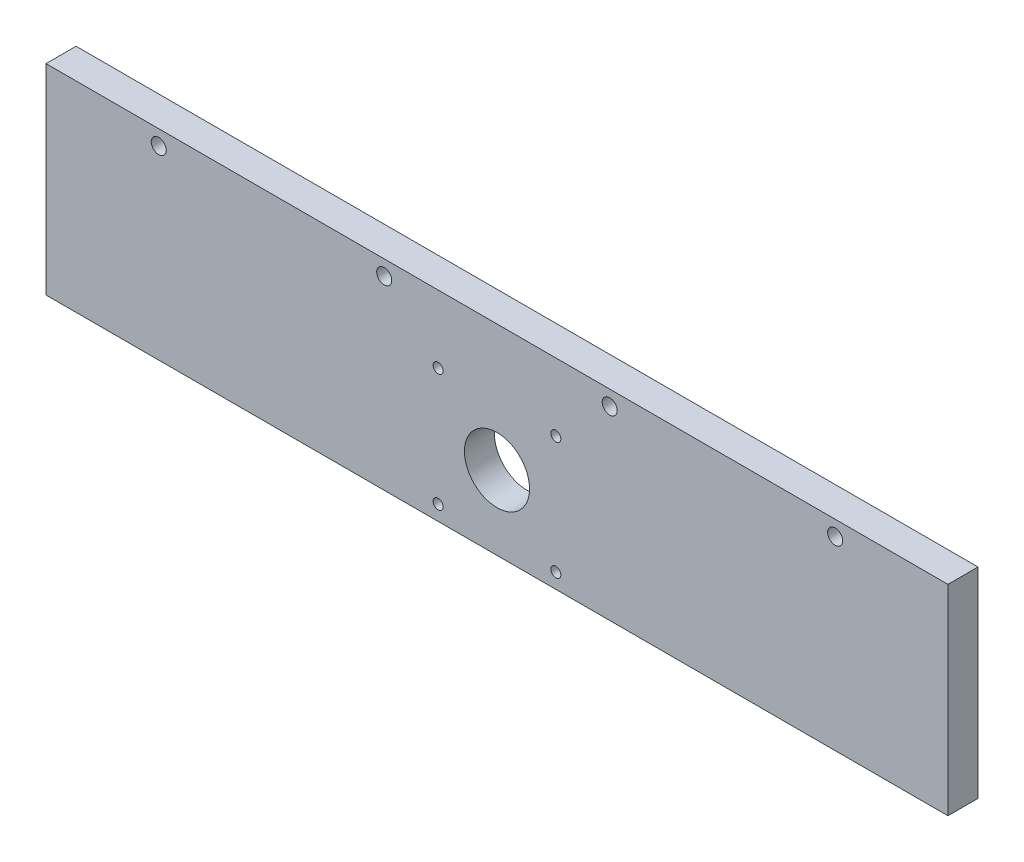
ISO-10303-21;
HEADER;
FILE_DESCRIPTION(('STEP AP214'),'2;1');
FILE_NAME('part.step','',(''),(''),'','','');
FILE_SCHEMA(('AUTOMOTIVE_DESIGN { 1 0 10303 214 1 1 1 1 }'));
ENDSEC;
DATA;
#1=APPLICATION_CONTEXT('core data for automotive mechanical design processes');
#2=APPLICATION_PROTOCOL_DEFINITION('international standard','automotive_design',2000,#1);
#3=PRODUCT_CONTEXT('',#1,'mechanical');
#4=PRODUCT('Part','Part','',(#3));
#5=PRODUCT_RELATED_PRODUCT_CATEGORY('part','',(#4));
#6=PRODUCT_DEFINITION_FORMATION('','',#4);
#7=PRODUCT_DEFINITION_CONTEXT('part definition',#1,'design');
#8=PRODUCT_DEFINITION('design','',#6,#7);
#9=PRODUCT_DEFINITION_SHAPE('','',#8);
#10=(LENGTH_UNIT() NAMED_UNIT(*) SI_UNIT(.MILLI.,.METRE.));
#11=(NAMED_UNIT(*) PLANE_ANGLE_UNIT() SI_UNIT($,.RADIAN.));
#12=(NAMED_UNIT(*) SI_UNIT($,.STERADIAN.) SOLID_ANGLE_UNIT());
#13=UNCERTAINTY_MEASURE_WITH_UNIT(LENGTH_MEASURE(1.E-05),#10,'distance_accuracy_value','');
#14=(GEOMETRIC_REPRESENTATION_CONTEXT(3) GLOBAL_UNCERTAINTY_ASSIGNED_CONTEXT((#13)) GLOBAL_UNIT_ASSIGNED_CONTEXT((#10,
#11,#12)) REPRESENTATION_CONTEXT('',''));
#15=CARTESIAN_POINT('',(0.,0.,0.));
#16=DIRECTION('',(0.,0.,1.));
#17=DIRECTION('',(1.,0.,0.));
#18=AXIS2_PLACEMENT_3D('',#15,#16,#17);
#19=CARTESIAN_POINT('',(180.,40.,12.));
#20=DIRECTION('',(0.,0.,-1.));
#21=DIRECTION('',(-1.,0.,0.));
#22=AXIS2_PLACEMENT_3D('',#19,#20,#21);
#23=PLANE('',#22);
#24=CARTESIAN_POINT('',(23.5,13.,12.));
#25=DIRECTION('',(0.,0.,-1.));
#26=DIRECTION('',(-1.,0.,0.));
#27=AXIS2_PLACEMENT_3D('',#24,#25,#26);
#28=CIRCLE('',#27,2.);
#29=CARTESIAN_POINT('',(21.5,13.,12.));
#30=VERTEX_POINT('',#29);
#31=EDGE_CURVE('E140',#30,#30,#28,.T.);
#32=ORIENTED_EDGE('',*,*,#31,.T.);
#33=EDGE_LOOP('',(#32));
#34=FACE_BOUND('',#33,.T.);
#35=CARTESIAN_POINT('',(-23.5,-34.,12.));
#36=DIRECTION('',(0.,0.,1.));
#37=DIRECTION('',(1.,0.,0.));
#38=AXIS2_PLACEMENT_3D('',#35,#36,#37);
#39=CIRCLE('',#38,2.00000000000001);
#40=CARTESIAN_POINT('',(-21.5,-34.,12.));
#41=VERTEX_POINT('',#40);
#42=EDGE_CURVE('E149',#41,#41,#39,.T.);
#43=ORIENTED_EDGE('',*,*,#42,.F.);
#44=EDGE_LOOP('',(#43));
#45=FACE_BOUND('',#44,.T.);
#46=CARTESIAN_POINT('',(-23.5,13.,12.));
#47=DIRECTION('',(0.,0.,1.));
#48=DIRECTION('',(1.,0.,0.));
#49=AXIS2_PLACEMENT_3D('',#46,#47,#48);
#50=CIRCLE('',#49,2.);
#51=CARTESIAN_POINT('',(-21.5,13.,12.));
#52=VERTEX_POINT('',#51);
#53=EDGE_CURVE('E155',#52,#52,#50,.T.);
#54=ORIENTED_EDGE('',*,*,#53,.F.);
#55=EDGE_LOOP('',(#54));
#56=FACE_BOUND('',#55,.T.);
#57=CARTESIAN_POINT('',(0.,-10.5,12.));
#58=DIRECTION('',(0.,0.,1.));
#59=DIRECTION('',(1.,0.,0.));
#60=AXIS2_PLACEMENT_3D('',#57,#58,#59);
#61=CIRCLE('',#60,13.);
#62=CARTESIAN_POINT('',(13.,-10.5,12.));
#63=VERTEX_POINT('',#62);
#64=EDGE_CURVE('E161',#63,#63,#61,.T.);
#65=ORIENTED_EDGE('',*,*,#64,.F.);
#66=EDGE_LOOP('',(#65));
#67=FACE_BOUND('',#66,.T.);
#68=CARTESIAN_POINT('',(45.,34.,12.));
#69=DIRECTION('',(0.,0.,1.));
#70=DIRECTION('',(1.,0.,0.));
#71=AXIS2_PLACEMENT_3D('',#68,#69,#70);
#72=CIRCLE('',#71,2.99999999999999);
#73=CARTESIAN_POINT('',(48.,34.,12.));
#74=VERTEX_POINT('',#73);
#75=EDGE_CURVE('E169',#74,#74,#72,.T.);
#76=ORIENTED_EDGE('',*,*,#75,.F.);
#77=EDGE_LOOP('',(#76));
#78=FACE_BOUND('',#77,.T.);
#79=CARTESIAN_POINT('',(135.,34.,12.));
#80=DIRECTION('',(0.,0.,1.));
#81=DIRECTION('',(1.,0.,0.));
#82=AXIS2_PLACEMENT_3D('',#79,#80,#81);
#83=CIRCLE('',#82,2.99999999999999);
#84=CARTESIAN_POINT('',(138.,34.,12.));
#85=VERTEX_POINT('',#84);
#86=EDGE_CURVE('E105',#85,#85,#83,.T.);
#87=ORIENTED_EDGE('',*,*,#86,.F.);
#88=EDGE_LOOP('',(#87));
#89=FACE_BOUND('',#88,.T.);
#90=DIRECTION('',(0.,1.,0.));
#91=VECTOR('',#90,1.);
#92=CARTESIAN_POINT('',(180.,-40.,12.));
#93=LINE('',#92,#91);
#94=CARTESIAN_POINT('',(180.,-40.,12.));
#95=VERTEX_POINT('',#94);
#96=CARTESIAN_POINT('',(180.,40.,12.));
#97=VERTEX_POINT('',#96);
#98=EDGE_CURVE('E87',#95,#97,#93,.T.);
#99=ORIENTED_EDGE('',*,*,#98,.T.);
#100=DIRECTION('',(-1.,0.,0.));
#101=VECTOR('',#100,1.);
#102=CARTESIAN_POINT('',(-180.,40.,12.));
#103=LINE('',#102,#101);
#104=CARTESIAN_POINT('',(-180.,40.,12.));
#105=VERTEX_POINT('',#104);
#106=EDGE_CURVE('E82',#97,#105,#103,.T.);
#107=ORIENTED_EDGE('',*,*,#106,.T.);
#108=DIRECTION('',(0.,-1.,0.));
#109=VECTOR('',#108,1.);
#110=CARTESIAN_POINT('',(-180.,-40.,12.));
#111=LINE('',#110,#109);
#112=CARTESIAN_POINT('',(-180.,-40.,12.));
#113=VERTEX_POINT('',#112);
#114=EDGE_CURVE('E85',#105,#113,#111,.T.);
#115=ORIENTED_EDGE('',*,*,#114,.T.);
#116=DIRECTION('',(1.,0.,0.));
#117=VECTOR('',#116,1.);
#118=CARTESIAN_POINT('',(-180.,-40.,12.));
#119=LINE('',#118,#117);
#120=EDGE_CURVE('E51',#113,#95,#119,.T.);
#121=ORIENTED_EDGE('',*,*,#120,.T.);
#122=EDGE_LOOP('',(#99,#107,#115,#121));
#123=FACE_BOUND('',#122,.T.);
#124=CARTESIAN_POINT('',(-45.,34.,12.));
#125=DIRECTION('',(0.,0.,1.));
#126=DIRECTION('',(1.,0.,0.));
#127=AXIS2_PLACEMENT_3D('',#124,#125,#126);
#128=CIRCLE('',#127,2.99999999999999);
#129=CARTESIAN_POINT('',(-42.,34.,12.));
#130=VERTEX_POINT('',#129);
#131=EDGE_CURVE('E115',#130,#130,#128,.T.);
#132=ORIENTED_EDGE('',*,*,#131,.F.);
#133=EDGE_LOOP('',(#132));
#134=FACE_BOUND('',#133,.T.);
#135=CARTESIAN_POINT('',(-135.,34.,12.));
#136=DIRECTION('',(0.,0.,1.));
#137=DIRECTION('',(1.,0.,0.));
#138=AXIS2_PLACEMENT_3D('',#135,#136,#137);
#139=CIRCLE('',#138,2.99999999999999);
#140=CARTESIAN_POINT('',(-132.,34.,12.));
#141=VERTEX_POINT('',#140);
#142=EDGE_CURVE('E11',#141,#141,#139,.T.);
#143=ORIENTED_EDGE('',*,*,#142,.F.);
#144=EDGE_LOOP('',(#143));
#145=FACE_BOUND('',#144,.T.);
#146=CARTESIAN_POINT('',(23.5,-34.,12.));
#147=DIRECTION('',(0.,0.,-1.));
#148=DIRECTION('',(-1.,0.,0.));
#149=AXIS2_PLACEMENT_3D('',#146,#147,#148);
#150=CIRCLE('',#149,2.00000000000001);
#151=CARTESIAN_POINT('',(21.5,-34.,12.));
#152=VERTEX_POINT('',#151);
#153=EDGE_CURVE('E135',#152,#152,#150,.T.);
#154=ORIENTED_EDGE('',*,*,#153,.T.);
#155=EDGE_LOOP('',(#154));
#156=FACE_BOUND('',#155,.T.);
#157=ADVANCED_FACE('F34',(#34,#45,#56,#67,#78,#89,#123,#134,#145,#156),#23,.F.);
#158=CARTESIAN_POINT('',(180.,40.,0.));
#159=DIRECTION('',(0.,0.,-1.));
#160=DIRECTION('',(-1.,0.,0.));
#161=AXIS2_PLACEMENT_3D('',#158,#159,#160);
#162=PLANE('',#161);
#163=CARTESIAN_POINT('',(23.5,13.,0.));
#164=DIRECTION('',(0.,0.,-1.));
#165=DIRECTION('',(-1.,0.,0.));
#166=AXIS2_PLACEMENT_3D('',#163,#164,#165);
#167=CIRCLE('',#166,2.);
#168=CARTESIAN_POINT('',(21.5,13.,0.));
#169=VERTEX_POINT('',#168);
#170=EDGE_CURVE('E145',#169,#169,#167,.T.);
#171=ORIENTED_EDGE('',*,*,#170,.F.);
#172=EDGE_LOOP('',(#171));
#173=FACE_BOUND('',#172,.T.);
#174=CARTESIAN_POINT('',(-23.5,-34.,0.));
#175=DIRECTION('',(0.,0.,-1.));
#176=DIRECTION('',(-1.,0.,0.));
#177=AXIS2_PLACEMENT_3D('',#174,#175,#176);
#178=CIRCLE('',#177,2.00000000000001);
#179=CARTESIAN_POINT('',(-25.5,-34.,0.));
#180=VERTEX_POINT('',#179);
#181=EDGE_CURVE('E148',#180,#180,#178,.F.);
#182=ORIENTED_EDGE('',*,*,#181,.T.);
#183=EDGE_LOOP('',(#182));
#184=FACE_BOUND('',#183,.T.);
#185=CARTESIAN_POINT('',(-23.5,13.,0.));
#186=DIRECTION('',(0.,0.,-1.));
#187=DIRECTION('',(-1.,0.,0.));
#188=AXIS2_PLACEMENT_3D('',#185,#186,#187);
#189=CIRCLE('',#188,2.);
#190=CARTESIAN_POINT('',(-25.5,13.,0.));
#191=VERTEX_POINT('',#190);
#192=EDGE_CURVE('E152',#191,#191,#189,.F.);
#193=ORIENTED_EDGE('',*,*,#192,.T.);
#194=EDGE_LOOP('',(#193));
#195=FACE_BOUND('',#194,.T.);
#196=CARTESIAN_POINT('',(0.,-10.5,0.));
#197=DIRECTION('',(0.,0.,-1.));
#198=DIRECTION('',(-1.,0.,0.));
#199=AXIS2_PLACEMENT_3D('',#196,#197,#198);
#200=CIRCLE('',#199,13.);
#201=CARTESIAN_POINT('',(-13.,-10.5,0.));
#202=VERTEX_POINT('',#201);
#203=EDGE_CURVE('E158',#202,#202,#200,.F.);
#204=ORIENTED_EDGE('',*,*,#203,.T.);
#205=EDGE_LOOP('',(#204));
#206=FACE_BOUND('',#205,.T.);
#207=CARTESIAN_POINT('',(45.,34.,0.));
#208=DIRECTION('',(0.,0.,-1.));
#209=DIRECTION('',(-1.,0.,0.));
#210=AXIS2_PLACEMENT_3D('',#207,#208,#209);
#211=CIRCLE('',#210,2.99999999999999);
#212=CARTESIAN_POINT('',(42.,34.,0.));
#213=VERTEX_POINT('',#212);
#214=EDGE_CURVE('E164',#213,#213,#211,.F.);
#215=ORIENTED_EDGE('',*,*,#214,.T.);
#216=EDGE_LOOP('',(#215));
#217=FACE_BOUND('',#216,.T.);
#218=CARTESIAN_POINT('',(135.,34.,0.));
#219=DIRECTION('',(0.,0.,-1.));
#220=DIRECTION('',(-1.,0.,0.));
#221=AXIS2_PLACEMENT_3D('',#218,#219,#220);
#222=CIRCLE('',#221,2.99999999999999);
#223=CARTESIAN_POINT('',(132.,34.,0.));
#224=VERTEX_POINT('',#223);
#225=EDGE_CURVE('E172',#224,#224,#222,.F.);
#226=ORIENTED_EDGE('',*,*,#225,.T.);
#227=EDGE_LOOP('',(#226));
#228=FACE_BOUND('',#227,.T.);
#229=DIRECTION('',(0.,1.,0.));
#230=VECTOR('',#229,1.);
#231=CARTESIAN_POINT('',(180.,-40.,0.));
#232=LINE('',#231,#230);
#233=CARTESIAN_POINT('',(180.,-40.,0.));
#234=VERTEX_POINT('',#233);
#235=CARTESIAN_POINT('',(180.,40.,0.));
#236=VERTEX_POINT('',#235);
#237=EDGE_CURVE('E102',#234,#236,#232,.T.);
#238=ORIENTED_EDGE('',*,*,#237,.F.);
#239=DIRECTION('',(1.,0.,0.));
#240=VECTOR('',#239,1.);
#241=CARTESIAN_POINT('',(-180.,-40.,0.));
#242=LINE('',#241,#240);
#243=CARTESIAN_POINT('',(-180.,-40.,0.));
#244=VERTEX_POINT('',#243);
#245=EDGE_CURVE('E74',#244,#234,#242,.T.);
#246=ORIENTED_EDGE('',*,*,#245,.F.);
#247=DIRECTION('',(0.,-1.,0.));
#248=VECTOR('',#247,1.);
#249=CARTESIAN_POINT('',(-180.,-40.,0.));
#250=LINE('',#249,#248);
#251=CARTESIAN_POINT('',(-180.,40.,0.));
#252=VERTEX_POINT('',#251);
#253=EDGE_CURVE('E68',#252,#244,#250,.T.);
#254=ORIENTED_EDGE('',*,*,#253,.F.);
#255=DIRECTION('',(-1.,0.,0.));
#256=VECTOR('',#255,1.);
#257=CARTESIAN_POINT('',(-180.,40.,0.));
#258=LINE('',#257,#256);
#259=EDGE_CURVE('E92',#236,#252,#258,.T.);
#260=ORIENTED_EDGE('',*,*,#259,.F.);
#261=EDGE_LOOP('',(#238,#246,#254,#260));
#262=FACE_BOUND('',#261,.T.);
#263=CARTESIAN_POINT('',(-45.,34.,0.));
#264=DIRECTION('',(0.,0.,-1.));
#265=DIRECTION('',(-1.,0.,0.));
#266=AXIS2_PLACEMENT_3D('',#263,#264,#265);
#267=CIRCLE('',#266,2.99999999999999);
#268=CARTESIAN_POINT('',(-48.,34.,0.));
#269=VERTEX_POINT('',#268);
#270=EDGE_CURVE('E112',#269,#269,#267,.F.);
#271=ORIENTED_EDGE('',*,*,#270,.T.);
#272=EDGE_LOOP('',(#271));
#273=FACE_BOUND('',#272,.T.);
#274=CARTESIAN_POINT('',(-135.,34.,0.));
#275=DIRECTION('',(0.,0.,-1.));
#276=DIRECTION('',(-1.,0.,0.));
#277=AXIS2_PLACEMENT_3D('',#274,#275,#276);
#278=CIRCLE('',#277,2.99999999999999);
#279=CARTESIAN_POINT('',(-138.,34.,0.));
#280=VERTEX_POINT('',#279);
#281=EDGE_CURVE('E43',#280,#280,#278,.F.);
#282=ORIENTED_EDGE('',*,*,#281,.T.);
#283=EDGE_LOOP('',(#282));
#284=FACE_BOUND('',#283,.T.);
#285=CARTESIAN_POINT('',(23.5,-34.,0.));
#286=DIRECTION('',(0.,0.,-1.));
#287=DIRECTION('',(-1.,0.,0.));
#288=AXIS2_PLACEMENT_3D('',#285,#286,#287);
#289=CIRCLE('',#288,2.00000000000001);
#290=CARTESIAN_POINT('',(21.5,-34.,0.));
#291=VERTEX_POINT('',#290);
#292=EDGE_CURVE('E137',#291,#291,#289,.T.);
#293=ORIENTED_EDGE('',*,*,#292,.F.);
#294=EDGE_LOOP('',(#293));
#295=FACE_BOUND('',#294,.T.);
#296=ADVANCED_FACE('F120',(#173,#184,#195,#206,#217,#228,#262,#273,#284,#295),#162,.T.);
#297=CARTESIAN_POINT('',(180.,-40.,12.));
#298=DIRECTION('',(-1.,0.,0.));
#299=DIRECTION('',(0.,0.,1.));
#300=AXIS2_PLACEMENT_3D('',#297,#298,#299);
#301=PLANE('',#300);
#302=ORIENTED_EDGE('',*,*,#237,.T.);
#303=DIRECTION('',(0.,0.,-1.));
#304=VECTOR('',#303,1.);
#305=CARTESIAN_POINT('',(180.,40.,12.));
#306=LINE('',#305,#304);
#307=EDGE_CURVE('E93',#97,#236,#306,.T.);
#308=ORIENTED_EDGE('',*,*,#307,.F.);
#309=ORIENTED_EDGE('',*,*,#98,.F.);
#310=DIRECTION('',(0.,0.,-1.));
#311=VECTOR('',#310,1.);
#312=CARTESIAN_POINT('',(180.,-40.,12.));
#313=LINE('',#312,#311);
#314=EDGE_CURVE('E98',#95,#234,#313,.T.);
#315=ORIENTED_EDGE('',*,*,#314,.T.);
#316=EDGE_LOOP('',(#302,#308,#309,#315));
#317=FACE_BOUND('',#316,.T.);
#318=ADVANCED_FACE('F198',(#317),#301,.F.);
#319=CARTESIAN_POINT('',(-180.,40.,12.));
#320=DIRECTION('',(0.,-1.,0.));
#321=DIRECTION('',(0.,0.,-1.));
#322=AXIS2_PLACEMENT_3D('',#319,#320,#321);
#323=PLANE('',#322);
#324=ORIENTED_EDGE('',*,*,#259,.T.);
#325=DIRECTION('',(0.,0.,-1.));
#326=VECTOR('',#325,1.);
#327=CARTESIAN_POINT('',(-180.,40.,12.));
#328=LINE('',#327,#326);
#329=EDGE_CURVE('E90',#105,#252,#328,.T.);
#330=ORIENTED_EDGE('',*,*,#329,.F.);
#331=ORIENTED_EDGE('',*,*,#106,.F.);
#332=ORIENTED_EDGE('',*,*,#307,.T.);
#333=EDGE_LOOP('',(#324,#330,#331,#332));
#334=FACE_BOUND('',#333,.T.);
#335=ADVANCED_FACE('F91',(#334),#323,.F.);
#336=CARTESIAN_POINT('',(-180.,-40.,12.));
#337=DIRECTION('',(1.,0.,0.));
#338=DIRECTION('',(0.,0.,-1.));
#339=AXIS2_PLACEMENT_3D('',#336,#337,#338);
#340=PLANE('',#339);
#341=ORIENTED_EDGE('',*,*,#253,.T.);
#342=DIRECTION('',(0.,0.,-1.));
#343=VECTOR('',#342,1.);
#344=CARTESIAN_POINT('',(-180.,-40.,12.));
#345=LINE('',#344,#343);
#346=EDGE_CURVE('E94',#113,#244,#345,.T.);
#347=ORIENTED_EDGE('',*,*,#346,.F.);
#348=ORIENTED_EDGE('',*,*,#114,.F.);
#349=ORIENTED_EDGE('',*,*,#329,.T.);
#350=EDGE_LOOP('',(#341,#347,#348,#349));
#351=FACE_BOUND('',#350,.T.);
#352=ADVANCED_FACE('F96',(#351),#340,.F.);
#353=CARTESIAN_POINT('',(-180.,-40.,12.));
#354=DIRECTION('',(0.,1.,0.));
#355=DIRECTION('',(0.,0.,1.));
#356=AXIS2_PLACEMENT_3D('',#353,#354,#355);
#357=PLANE('',#356);
#358=ORIENTED_EDGE('',*,*,#245,.T.);
#359=ORIENTED_EDGE('',*,*,#314,.F.);
#360=ORIENTED_EDGE('',*,*,#120,.F.);
#361=ORIENTED_EDGE('',*,*,#346,.T.);
#362=EDGE_LOOP('',(#358,#359,#360,#361));
#363=FACE_BOUND('',#362,.T.);
#364=ADVANCED_FACE('F184',(#363),#357,.F.);
#365=CARTESIAN_POINT('',(135.,34.,-0.000999999999999265));
#366=DIRECTION('',(0.,0.,1.));
#367=DIRECTION('',(1.,0.,0.));
#368=AXIS2_PLACEMENT_3D('',#365,#366,#367);
#369=CYLINDRICAL_SURFACE('',#368,2.99999999999999);
#370=ORIENTED_EDGE('',*,*,#225,.F.);
#371=EDGE_LOOP('',(#370));
#372=FACE_BOUND('',#371,.T.);
#373=ORIENTED_EDGE('',*,*,#86,.T.);
#374=EDGE_LOOP('',(#373));
#375=FACE_BOUND('',#374,.T.);
#376=ADVANCED_FACE('F180',(#372,#375),#369,.F.);
#377=CARTESIAN_POINT('',(45.,34.,-0.000999999999999265));
#378=DIRECTION('',(0.,0.,1.));
#379=DIRECTION('',(1.,0.,0.));
#380=AXIS2_PLACEMENT_3D('',#377,#378,#379);
#381=CYLINDRICAL_SURFACE('',#380,2.99999999999999);
#382=ORIENTED_EDGE('',*,*,#214,.F.);
#383=EDGE_LOOP('',(#382));
#384=FACE_BOUND('',#383,.T.);
#385=ORIENTED_EDGE('',*,*,#75,.T.);
#386=EDGE_LOOP('',(#385));
#387=FACE_BOUND('',#386,.T.);
#388=ADVANCED_FACE('F183',(#384,#387),#381,.F.);
#389=CARTESIAN_POINT('',(-45.,34.,-0.000999999999999265));
#390=DIRECTION('',(0.,0.,1.));
#391=DIRECTION('',(1.,0.,0.));
#392=AXIS2_PLACEMENT_3D('',#389,#390,#391);
#393=CYLINDRICAL_SURFACE('',#392,2.99999999999999);
#394=ORIENTED_EDGE('',*,*,#270,.F.);
#395=EDGE_LOOP('',(#394));
#396=FACE_BOUND('',#395,.T.);
#397=ORIENTED_EDGE('',*,*,#131,.T.);
#398=EDGE_LOOP('',(#397));
#399=FACE_BOUND('',#398,.T.);
#400=ADVANCED_FACE('F126',(#396,#399),#393,.F.);
#401=CARTESIAN_POINT('',(-135.,34.,-0.000999999999999265));
#402=DIRECTION('',(0.,0.,1.));
#403=DIRECTION('',(1.,0.,0.));
#404=AXIS2_PLACEMENT_3D('',#401,#402,#403);
#405=CYLINDRICAL_SURFACE('',#404,2.99999999999999);
#406=ORIENTED_EDGE('',*,*,#281,.F.);
#407=EDGE_LOOP('',(#406));
#408=FACE_BOUND('',#407,.T.);
#409=ORIENTED_EDGE('',*,*,#142,.T.);
#410=EDGE_LOOP('',(#409));
#411=FACE_BOUND('',#410,.T.);
#412=ADVANCED_FACE('F36',(#408,#411),#405,.F.);
#413=CARTESIAN_POINT('',(0.,-10.5,-0.000999999999999265));
#414=DIRECTION('',(0.,0.,1.));
#415=DIRECTION('',(1.,0.,0.));
#416=AXIS2_PLACEMENT_3D('',#413,#414,#415);
#417=CYLINDRICAL_SURFACE('',#416,13.);
#418=ORIENTED_EDGE('',*,*,#203,.F.);
#419=EDGE_LOOP('',(#418));
#420=FACE_BOUND('',#419,.T.);
#421=ORIENTED_EDGE('',*,*,#64,.T.);
#422=EDGE_LOOP('',(#421));
#423=FACE_BOUND('',#422,.T.);
#424=ADVANCED_FACE('F125',(#420,#423),#417,.F.);
#425=CARTESIAN_POINT('',(-23.5,13.,-0.000999999999999265));
#426=DIRECTION('',(0.,0.,1.));
#427=DIRECTION('',(1.,0.,0.));
#428=AXIS2_PLACEMENT_3D('',#425,#426,#427);
#429=CYLINDRICAL_SURFACE('',#428,2.);
#430=ORIENTED_EDGE('',*,*,#192,.F.);
#431=EDGE_LOOP('',(#430));
#432=FACE_BOUND('',#431,.T.);
#433=ORIENTED_EDGE('',*,*,#53,.T.);
#434=EDGE_LOOP('',(#433));
#435=FACE_BOUND('',#434,.T.);
#436=ADVANCED_FACE('F227',(#432,#435),#429,.F.);
#437=CARTESIAN_POINT('',(-23.5,-34.,-0.000999999999999265));
#438=DIRECTION('',(0.,0.,1.));
#439=DIRECTION('',(1.,0.,0.));
#440=AXIS2_PLACEMENT_3D('',#437,#438,#439);
#441=CYLINDRICAL_SURFACE('',#440,2.00000000000001);
#442=ORIENTED_EDGE('',*,*,#181,.F.);
#443=EDGE_LOOP('',(#442));
#444=FACE_BOUND('',#443,.T.);
#445=ORIENTED_EDGE('',*,*,#42,.T.);
#446=EDGE_LOOP('',(#445));
#447=FACE_BOUND('',#446,.T.);
#448=ADVANCED_FACE('F234',(#444,#447),#441,.F.);
#449=CARTESIAN_POINT('',(23.5,13.,-0.000999999999999265));
#450=DIRECTION('',(0.,0.,1.));
#451=DIRECTION('',(1.,0.,0.));
#452=AXIS2_PLACEMENT_3D('',#449,#450,#451);
#453=CYLINDRICAL_SURFACE('',#452,2.);
#454=ORIENTED_EDGE('',*,*,#170,.T.);
#455=EDGE_LOOP('',(#454));
#456=FACE_BOUND('',#455,.T.);
#457=ORIENTED_EDGE('',*,*,#31,.F.);
#458=EDGE_LOOP('',(#457));
#459=FACE_BOUND('',#458,.T.);
#460=ADVANCED_FACE('F242',(#456,#459),#453,.F.);
#461=CARTESIAN_POINT('',(23.5,-34.,-0.000999999999999265));
#462=DIRECTION('',(0.,0.,1.));
#463=DIRECTION('',(1.,0.,0.));
#464=AXIS2_PLACEMENT_3D('',#461,#462,#463);
#465=CYLINDRICAL_SURFACE('',#464,2.00000000000001);
#466=ORIENTED_EDGE('',*,*,#292,.T.);
#467=EDGE_LOOP('',(#466));
#468=FACE_BOUND('',#467,.T.);
#469=ORIENTED_EDGE('',*,*,#153,.F.);
#470=EDGE_LOOP('',(#469));
#471=FACE_BOUND('',#470,.T.);
#472=ADVANCED_FACE('F251',(#468,#471),#465,.F.);
#473=CLOSED_SHELL('',(#157,#296,#318,#335,#352,#364,#376,#388,#400,#412,#424,#436,#448,#460,#472));
#474=MANIFOLD_SOLID_BREP('B2',#473);
#475=ADVANCED_BREP_SHAPE_REPRESENTATION('',(#18,#474),#14);
#476=SHAPE_DEFINITION_REPRESENTATION(#9,#475);
ENDSEC;
END-ISO-10303-21;
